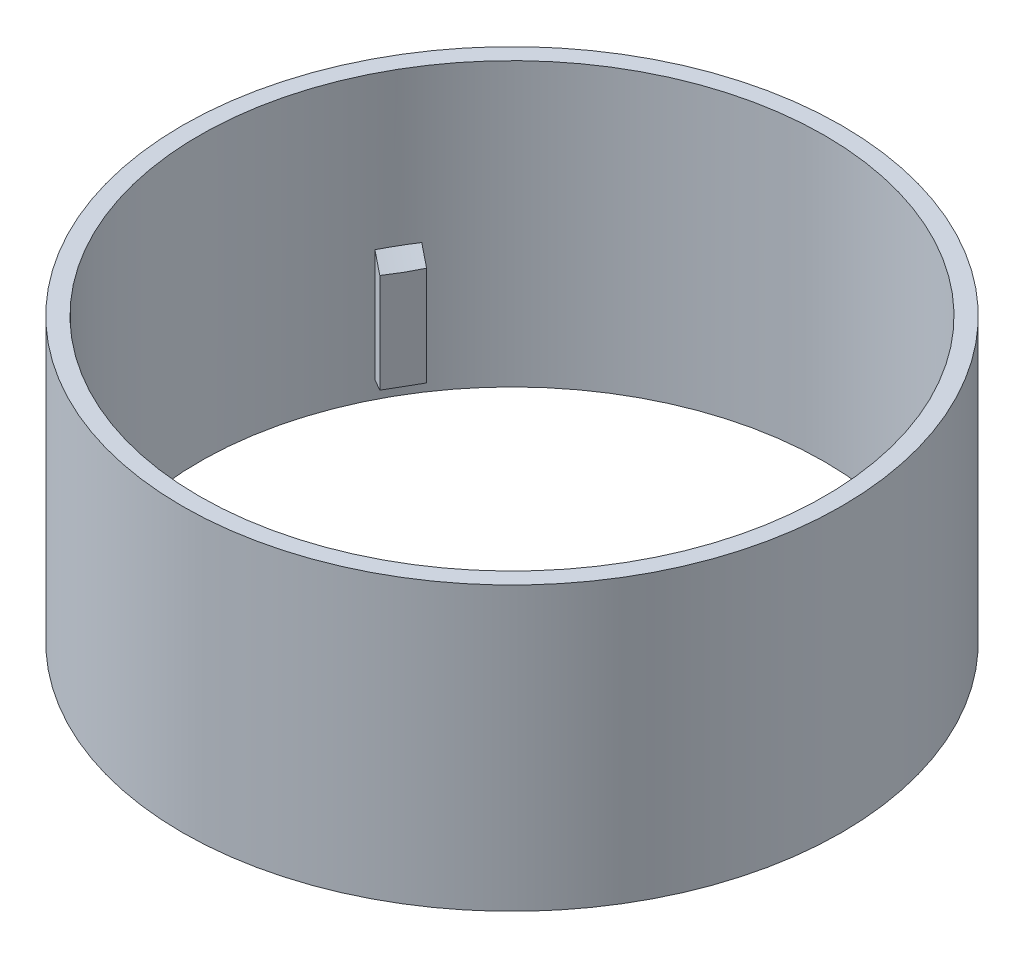
ISO-10303-21;
HEADER;
FILE_DESCRIPTION(('STEP AP214'),'2;1');
FILE_NAME('part.step','',(''),(''),'','','');
FILE_SCHEMA(('AUTOMOTIVE_DESIGN { 1 0 10303 214 1 1 1 1 }'));
ENDSEC;
DATA;
#1=APPLICATION_CONTEXT('core data for automotive mechanical design processes');
#2=APPLICATION_PROTOCOL_DEFINITION('international standard','automotive_design',2000,#1);
#3=PRODUCT_CONTEXT('',#1,'mechanical');
#4=PRODUCT('Part','Part','',(#3));
#5=PRODUCT_RELATED_PRODUCT_CATEGORY('part','',(#4));
#6=PRODUCT_DEFINITION_FORMATION('','',#4);
#7=PRODUCT_DEFINITION_CONTEXT('part definition',#1,'design');
#8=PRODUCT_DEFINITION('design','',#6,#7);
#9=PRODUCT_DEFINITION_SHAPE('','',#8);
#10=(LENGTH_UNIT() NAMED_UNIT(*) SI_UNIT(.MILLI.,.METRE.));
#11=(NAMED_UNIT(*) PLANE_ANGLE_UNIT() SI_UNIT($,.RADIAN.));
#12=(NAMED_UNIT(*) SI_UNIT($,.STERADIAN.) SOLID_ANGLE_UNIT());
#13=UNCERTAINTY_MEASURE_WITH_UNIT(LENGTH_MEASURE(1.E-05),#10,'distance_accuracy_value','');
#14=(GEOMETRIC_REPRESENTATION_CONTEXT(3) GLOBAL_UNCERTAINTY_ASSIGNED_CONTEXT((#13)) GLOBAL_UNIT_ASSIGNED_CONTEXT((#10,
#11,#12)) REPRESENTATION_CONTEXT('',''));
#15=CARTESIAN_POINT('',(0.,0.,0.));
#16=DIRECTION('',(0.,0.,1.));
#17=DIRECTION('',(1.,0.,0.));
#18=AXIS2_PLACEMENT_3D('',#15,#16,#17);
#19=CARTESIAN_POINT('',(0.,40.,0.));
#20=DIRECTION('',(0.,-1.,0.));
#21=DIRECTION('',(0.,0.,-1.));
#22=AXIS2_PLACEMENT_3D('',#19,#20,#21);
#23=CYLINDRICAL_SURFACE('',#22,38.5);
#24=CARTESIAN_POINT('',(0.,40.,0.));
#25=DIRECTION('',(0.,1.,0.));
#26=DIRECTION('',(0.,0.,1.));
#27=AXIS2_PLACEMENT_3D('',#24,#25,#26);
#28=CIRCLE('',#27,38.5);
#29=CARTESIAN_POINT('',(0.,40.,38.5));
#30=VERTEX_POINT('',#29);
#31=EDGE_CURVE('E190',#30,#30,#28,.T.);
#32=ORIENTED_EDGE('',*,*,#31,.F.);
#33=EDGE_LOOP('',(#32));
#34=FACE_BOUND('',#33,.T.);
#35=CARTESIAN_POINT('',(0.,7.,0.));
#36=DIRECTION('',(0.,-1.,0.));
#37=DIRECTION('',(0.,0.,-1.));
#38=AXIS2_PLACEMENT_3D('',#35,#36,#37);
#39=CIRCLE('',#38,38.5);
#40=CARTESIAN_POINT('',(0.,7.,-38.5));
#41=VERTEX_POINT('',#40);
#42=EDGE_CURVE('E154',#41,#41,#39,.T.);
#43=ORIENTED_EDGE('',*,*,#42,.F.);
#44=EDGE_LOOP('',(#43));
#45=FACE_BOUND('',#44,.T.);
#46=ADVANCED_FACE('F35',(#34,#45),#23,.T.);
#47=CARTESIAN_POINT('',(0.,40.,0.));
#48=DIRECTION('',(0.,-1.,0.));
#49=DIRECTION('',(0.,0.,-1.));
#50=AXIS2_PLACEMENT_3D('',#47,#48,#49);
#51=CYLINDRICAL_SURFACE('',#50,36.5);
#52=CARTESIAN_POINT('',(0.,40.,0.));
#53=DIRECTION('',(0.,1.,0.));
#54=DIRECTION('',(0.,0.,1.));
#55=AXIS2_PLACEMENT_3D('',#52,#53,#54);
#56=CIRCLE('',#55,36.5);
#57=CARTESIAN_POINT('',(0.,40.,36.5));
#58=VERTEX_POINT('',#57);
#59=EDGE_CURVE('E185',#58,#58,#56,.T.);
#60=ORIENTED_EDGE('',*,*,#59,.T.);
#61=EDGE_LOOP('',(#60));
#62=FACE_BOUND('',#61,.T.);
#63=DIRECTION('',(0.,-1.,0.));
#64=VECTOR('',#63,1.);
#65=CARTESIAN_POINT('',(1.95,40.,36.4478737377093));
#66=LINE('',#65,#64);
#67=CARTESIAN_POINT('',(1.95,22.1470722684002,36.4478737377093));
#68=VERTEX_POINT('',#67);
#69=CARTESIAN_POINT('',(1.95,9.,36.4478737377093));
#70=VERTEX_POINT('',#69);
#71=EDGE_CURVE('E198',#68,#70,#66,.T.);
#72=ORIENTED_EDGE('',*,*,#71,.F.);
#73=CARTESIAN_POINT('',(0.,22.1470722684002,0.));
#74=DIRECTION('',(0.,1.,0.));
#75=DIRECTION('',(0.,0.,1.));
#76=AXIS2_PLACEMENT_3D('',#73,#74,#75);
#77=CIRCLE('',#76,36.5);
#78=CARTESIAN_POINT('',(-2.05,22.1470722684002,36.4423860360432));
#79=VERTEX_POINT('',#78);
#80=EDGE_CURVE('E223',#68,#79,#77,.F.);
#81=ORIENTED_EDGE('',*,*,#80,.T.);
#82=DIRECTION('',(0.,-1.,0.));
#83=VECTOR('',#82,1.);
#84=CARTESIAN_POINT('',(-2.05,40.,36.4423860360432));
#85=LINE('',#84,#83);
#86=CARTESIAN_POINT('',(-2.05,9.,36.4423860360432));
#87=VERTEX_POINT('',#86);
#88=EDGE_CURVE('E196',#87,#79,#85,.F.);
#89=ORIENTED_EDGE('',*,*,#88,.F.);
#90=CARTESIAN_POINT('',(0.,9.,0.));
#91=DIRECTION('',(0.,-1.,0.));
#92=DIRECTION('',(0.,0.,-1.));
#93=AXIS2_PLACEMENT_3D('',#90,#91,#92);
#94=CIRCLE('',#93,36.5);
#95=EDGE_CURVE('E193',#70,#87,#94,.T.);
#96=ORIENTED_EDGE('',*,*,#95,.F.);
#97=EDGE_LOOP('',(#72,#81,#89,#96));
#98=FACE_BOUND('',#97,.T.);
#99=DIRECTION('',(0.,-1.,0.));
#100=VECTOR('',#99,1.);
#101=CARTESIAN_POINT('',(-32.5397845707839,40.,-16.5351873314752));
#102=LINE('',#101,#100);
#103=CARTESIAN_POINT('',(-32.5397845707839,22.1470722684002,-16.5351873314752));
#104=VERTEX_POINT('',#103);
#105=CARTESIAN_POINT('',(-32.5397845707839,9.,-16.5351873314752));
#106=VERTEX_POINT('',#105);
#107=EDGE_CURVE('E206',#104,#106,#102,.T.);
#108=ORIENTED_EDGE('',*,*,#107,.F.);
#109=CARTESIAN_POINT('',(0.,22.1470722684002,0.));
#110=DIRECTION('',(0.,1.,0.));
#111=DIRECTION('',(0.,0.,1.));
#112=AXIS2_PLACEMENT_3D('',#109,#110,#111);
#113=CIRCLE('',#112,36.5);
#114=CARTESIAN_POINT('',(-30.5350320817326,22.1470722684002,-19.9965450957799));
#115=VERTEX_POINT('',#114);
#116=EDGE_CURVE('E220',#104,#115,#113,.F.);
#117=ORIENTED_EDGE('',*,*,#116,.T.);
#118=DIRECTION('',(0.,-1.,0.));
#119=VECTOR('',#118,1.);
#120=CARTESIAN_POINT('',(-30.5350320817326,40.,-19.9965450957799));
#121=LINE('',#120,#119);
#122=CARTESIAN_POINT('',(-30.5350320817326,9.,-19.9965450957799));
#123=VERTEX_POINT('',#122);
#124=EDGE_CURVE('E204',#123,#115,#121,.F.);
#125=ORIENTED_EDGE('',*,*,#124,.F.);
#126=CARTESIAN_POINT('',(0.,9.,0.));
#127=DIRECTION('',(0.,-1.,0.));
#128=DIRECTION('',(0.,0.,-1.));
#129=AXIS2_PLACEMENT_3D('',#126,#127,#128);
#130=CIRCLE('',#129,36.5);
#131=EDGE_CURVE('E201',#106,#123,#130,.T.);
#132=ORIENTED_EDGE('',*,*,#131,.F.);
#133=EDGE_LOOP('',(#108,#117,#125,#132));
#134=FACE_BOUND('',#133,.T.);
#135=DIRECTION('',(0.,-1.,0.));
#136=VECTOR('',#135,1.);
#137=CARTESIAN_POINT('',(30.5897845707841,40.,-19.912686406234));
#138=LINE('',#137,#136);
#139=CARTESIAN_POINT('',(30.5897845707841,22.1470722684002,-19.912686406234));
#140=VERTEX_POINT('',#139);
#141=CARTESIAN_POINT('',(30.5897845707841,9.,-19.912686406234));
#142=VERTEX_POINT('',#141);
#143=EDGE_CURVE('E212',#140,#142,#138,.T.);
#144=ORIENTED_EDGE('',*,*,#143,.F.);
#145=CARTESIAN_POINT('',(0.,22.1470722684002,0.));
#146=DIRECTION('',(0.,1.,0.));
#147=DIRECTION('',(0.,0.,1.));
#148=AXIS2_PLACEMENT_3D('',#145,#146,#147);
#149=CIRCLE('',#148,36.5);
#150=CARTESIAN_POINT('',(32.5850320817329,22.1470722684002,-16.4458409402632));
#151=VERTEX_POINT('',#150);
#152=EDGE_CURVE('E215',#140,#151,#149,.F.);
#153=ORIENTED_EDGE('',*,*,#152,.T.);
#154=DIRECTION('',(0.,-1.,0.));
#155=VECTOR('',#154,1.);
#156=CARTESIAN_POINT('',(32.5850320817329,40.,-16.4458409402632));
#157=LINE('',#156,#155);
#158=CARTESIAN_POINT('',(32.5850320817329,9.,-16.4458409402632));
#159=VERTEX_POINT('',#158);
#160=EDGE_CURVE('E210',#159,#151,#157,.F.);
#161=ORIENTED_EDGE('',*,*,#160,.F.);
#162=CARTESIAN_POINT('',(0.,9.,0.));
#163=DIRECTION('',(0.,-1.,0.));
#164=DIRECTION('',(0.,0.,-1.));
#165=AXIS2_PLACEMENT_3D('',#162,#163,#164);
#166=CIRCLE('',#165,36.5);
#167=EDGE_CURVE('E145',#142,#159,#166,.T.);
#168=ORIENTED_EDGE('',*,*,#167,.F.);
#169=EDGE_LOOP('',(#144,#153,#161,#168));
#170=FACE_BOUND('',#169,.T.);
#171=CARTESIAN_POINT('',(0.,7.,0.));
#172=DIRECTION('',(0.,-1.,0.));
#173=DIRECTION('',(0.,0.,-1.));
#174=AXIS2_PLACEMENT_3D('',#171,#172,#173);
#175=CIRCLE('',#174,36.5);
#176=CARTESIAN_POINT('',(0.,7.,-36.5));
#177=VERTEX_POINT('',#176);
#178=EDGE_CURVE('E157',#177,#177,#175,.T.);
#179=ORIENTED_EDGE('',*,*,#178,.T.);
#180=EDGE_LOOP('',(#179));
#181=FACE_BOUND('',#180,.T.);
#182=ADVANCED_FACE('F264',(#62,#98,#134,#170,#181),#51,.F.);
#183=CARTESIAN_POINT('',(0.,40.,0.));
#184=DIRECTION('',(0.,1.,0.));
#185=DIRECTION('',(0.,0.,1.));
#186=AXIS2_PLACEMENT_3D('',#183,#184,#185);
#187=PLANE('',#186);
#188=ORIENTED_EDGE('',*,*,#31,.T.);
#189=EDGE_LOOP('',(#188));
#190=FACE_BOUND('',#189,.T.);
#191=ORIENTED_EDGE('',*,*,#59,.F.);
#192=EDGE_LOOP('',(#191));
#193=FACE_BOUND('',#192,.T.);
#194=ADVANCED_FACE('F258',(#190,#193),#187,.T.);
#195=CARTESIAN_POINT('',(1.95,9.,34.9));
#196=DIRECTION('',(0.,-1.,0.));
#197=DIRECTION('',(0.,0.,-1.));
#198=AXIS2_PLACEMENT_3D('',#195,#196,#197);
#199=PLANE('',#198);
#200=DIRECTION('',(0.,0.,1.));
#201=VECTOR('',#200,1.);
#202=CARTESIAN_POINT('',(1.95,9.,34.9));
#203=LINE('',#202,#201);
#204=CARTESIAN_POINT('',(1.95,9.,34.9));
#205=VERTEX_POINT('',#204);
#206=EDGE_CURVE('E182',#205,#70,#203,.T.);
#207=ORIENTED_EDGE('',*,*,#206,.T.);
#208=ORIENTED_EDGE('',*,*,#95,.T.);
#209=DIRECTION('',(0.,0.,1.));
#210=VECTOR('',#209,1.);
#211=CARTESIAN_POINT('',(-2.05,9.,34.9));
#212=LINE('',#211,#210);
#213=CARTESIAN_POINT('',(-2.05,9.,34.9));
#214=VERTEX_POINT('',#213);
#215=EDGE_CURVE('E181',#214,#87,#212,.T.);
#216=ORIENTED_EDGE('',*,*,#215,.F.);
#217=DIRECTION('',(1.,0.,0.));
#218=VECTOR('',#217,1.);
#219=CARTESIAN_POINT('',(1.95,9.,34.9));
#220=LINE('',#219,#218);
#221=EDGE_CURVE('E177',#214,#205,#220,.T.);
#222=ORIENTED_EDGE('',*,*,#221,.T.);
#223=EDGE_LOOP('',(#207,#208,#216,#222));
#224=FACE_BOUND('',#223,.T.);
#225=ADVANCED_FACE('F255',(#224),#199,.T.);
#226=CARTESIAN_POINT('',(-2.05,20.4470722684002,34.9));
#227=DIRECTION('',(-1.,0.,0.));
#228=DIRECTION('',(0.,-1.,0.));
#229=AXIS2_PLACEMENT_3D('',#226,#227,#228);
#230=PLANE('',#229);
#231=ORIENTED_EDGE('',*,*,#215,.T.);
#232=ORIENTED_EDGE('',*,*,#88,.T.);
#233=CARTESIAN_POINT('',(-2.05,22.1470722684002,36.4423860360432));
#234=CARTESIAN_POINT('',(-2.05,21.8904224321134,36.1853308332608));
#235=CARTESIAN_POINT('',(-2.05,21.6337771716459,35.9282710622002));
#236=CARTESIAN_POINT('',(-2.05,21.1204958023463,35.4141423835191));
#237=CARTESIAN_POINT('',(-2.05,20.863859693514,35.1570734758987));
#238=CARTESIAN_POINT('',(-2.05,20.6072281605011,34.9));
#239=B_SPLINE_CURVE_WITH_KNOTS('',3,(#233,#234,#235,#236,#237,#238),.UNSPECIFIED.,.F.,.F.,(4,2,
4),(0.,1.08973328872857,2.17946657747203),.UNSPECIFIED.);
#240=CARTESIAN_POINT('',(-2.05,20.6072281605011,34.9));
#241=VERTEX_POINT('',#240);
#242=EDGE_CURVE('E266',#79,#241,#239,.T.);
#243=ORIENTED_EDGE('',*,*,#242,.T.);
#244=DIRECTION('',(0.,-1.,0.));
#245=VECTOR('',#244,1.);
#246=CARTESIAN_POINT('',(-2.05,20.4470722684002,34.9));
#247=LINE('',#246,#245);
#248=EDGE_CURVE('E76',#241,#214,#247,.T.);
#249=ORIENTED_EDGE('',*,*,#248,.T.);
#250=EDGE_LOOP('',(#231,#232,#243,#249));
#251=FACE_BOUND('',#250,.T.);
#252=ADVANCED_FACE('F254',(#251),#230,.T.);
#253=CARTESIAN_POINT('',(1.95,20.4470722684002,34.9));
#254=DIRECTION('',(1.,0.,0.));
#255=DIRECTION('',(0.,1.,0.));
#256=AXIS2_PLACEMENT_3D('',#253,#254,#255);
#257=PLANE('',#256);
#258=DIRECTION('',(0.,1.,0.));
#259=VECTOR('',#258,1.);
#260=CARTESIAN_POINT('',(1.95,20.4470722684002,34.9));
#261=LINE('',#260,#259);
#262=CARTESIAN_POINT('',(1.95,20.6015068940668,34.9));
#263=VERTEX_POINT('',#262);
#264=EDGE_CURVE('E85',#205,#263,#261,.T.);
#265=ORIENTED_EDGE('',*,*,#264,.T.);
#266=CARTESIAN_POINT('',(1.95,20.6015068940668,34.9));
#267=CARTESIAN_POINT('',(1.95,20.8590927827987,35.1579872841735));
#268=CARTESIAN_POINT('',(1.95,21.1166828416931,35.4159704044034));
#269=CARTESIAN_POINT('',(1.95,21.6318712998042,35.9319283169732));
#270=CARTESIAN_POINT('',(1.95,21.8894696990209,36.189903109313));
#271=CARTESIAN_POINT('',(1.95,22.1470722684002,36.4478737377093));
#272=B_SPLINE_CURVE_WITH_KNOTS('',3,(#266,#267,#268,#269,#270,#271),.UNSPECIFIED.,.F.,.F.,(4,2,
4),(0.,1.09369619130872,2.18739238260507),.UNSPECIFIED.);
#273=EDGE_CURVE('E233',#263,#68,#272,.T.);
#274=ORIENTED_EDGE('',*,*,#273,.T.);
#275=ORIENTED_EDGE('',*,*,#71,.T.);
#276=ORIENTED_EDGE('',*,*,#206,.F.);
#277=EDGE_LOOP('',(#265,#274,#275,#276));
#278=FACE_BOUND('',#277,.T.);
#279=ADVANCED_FACE('F247',(#278),#257,.T.);
#280=CARTESIAN_POINT('',(0.,0.,34.9));
#281=DIRECTION('',(0.,0.,-1.));
#282=DIRECTION('',(-1.,0.,0.));
#283=AXIS2_PLACEMENT_3D('',#280,#281,#282);
#284=PLANE('',#283);
#285=ORIENTED_EDGE('',*,*,#248,.F.);
#286=CARTESIAN_POINT('',(-2.05,20.6072281605011,34.9));
#287=CARTESIAN_POINT('',(-1.38331294182691,20.5680973376424,34.9));
#288=CARTESIAN_POINT('',(-0.71659863925139,20.5480572443269,34.9));
#289=CARTESIAN_POINT('',(0.616734706318611,20.546158730007,34.9));
#290=CARTESIAN_POINT('',(1.28335373707643,20.5642917345111,34.9));
#291=CARTESIAN_POINT('',(1.95,20.6015068940668,34.9));
#292=B_SPLINE_CURVE_WITH_KNOTS('',3,(#286,#287,#288,#289,#290,#291),.UNSPECIFIED.,.F.,.F.,(4,2,
4),(0.,2.00104625118703,4.00164307268493),.UNSPECIFIED.);
#293=EDGE_CURVE('E226',#241,#263,#292,.T.);
#294=ORIENTED_EDGE('',*,*,#293,.T.);
#295=ORIENTED_EDGE('',*,*,#264,.F.);
#296=ORIENTED_EDGE('',*,*,#221,.F.);
#297=EDGE_LOOP('',(#285,#294,#295,#296));
#298=FACE_BOUND('',#297,.T.);
#299=ADVANCED_FACE('F242',(#298),#284,.T.);
#300=CARTESIAN_POINT('',(-31.1992865920768,9.,-15.7612504626205));
#301=DIRECTION('',(0.,-1.,0.));
#302=DIRECTION('',(0.,0.,-1.));
#303=AXIS2_PLACEMENT_3D('',#300,#301,#302);
#304=PLANE('',#303);
#305=DIRECTION('',(-0.866025403784436,0.,-0.500000000000004));
#306=VECTOR('',#305,1.);
#307=CARTESIAN_POINT('',(-31.1992865920768,9.,-15.7612504626205));
#308=LINE('',#307,#306);
#309=CARTESIAN_POINT('',(-31.1992865920768,9.,-15.7612504626205));
#310=VERTEX_POINT('',#309);
#311=EDGE_CURVE('E171',#310,#106,#308,.T.);
#312=ORIENTED_EDGE('',*,*,#311,.T.);
#313=ORIENTED_EDGE('',*,*,#131,.T.);
#314=DIRECTION('',(-0.866025403784436,0.,-0.500000000000004));
#315=VECTOR('',#314,1.);
#316=CARTESIAN_POINT('',(-29.1992865920768,9.,-19.2253520777582));
#317=LINE('',#316,#315);
#318=CARTESIAN_POINT('',(-29.1992865920768,9.,-19.2253520777582));
#319=VERTEX_POINT('',#318);
#320=EDGE_CURVE('E170',#319,#123,#317,.T.);
#321=ORIENTED_EDGE('',*,*,#320,.F.);
#322=DIRECTION('',(-0.500000000000004,0.,0.866025403784436));
#323=VECTOR('',#322,1.);
#324=CARTESIAN_POINT('',(-31.1992865920768,9.,-15.7612504626205));
#325=LINE('',#324,#323);
#326=EDGE_CURVE('E165',#319,#310,#325,.T.);
#327=ORIENTED_EDGE('',*,*,#326,.T.);
#328=EDGE_LOOP('',(#312,#313,#321,#327));
#329=FACE_BOUND('',#328,.T.);
#330=ADVANCED_FACE('F246',(#329),#304,.T.);
#331=CARTESIAN_POINT('',(-29.1992865920768,20.4470722684002,-19.2253520777582));
#332=DIRECTION('',(0.500000000000004,0.,-0.866025403784436));
#333=DIRECTION('',(-0.866025403784436,0.,-0.500000000000004));
#334=AXIS2_PLACEMENT_3D('',#331,#332,#333);
#335=PLANE('',#334);
#336=ORIENTED_EDGE('',*,*,#320,.T.);
#337=ORIENTED_EDGE('',*,*,#124,.T.);
#338=CARTESIAN_POINT('',(-30.5350320817326,22.1470722684002,-19.9965450957799));
#339=CARTESIAN_POINT('',(-30.3124157459481,21.8904224321134,-19.8680174943886));
#340=CARTESIAN_POINT('',(-30.0897954539186,21.6337771716459,-19.7394876088583));
#341=CARTESIAN_POINT('',(-29.6445469573667,21.1204958023463,-19.4824232695178));
#342=CARTESIAN_POINT('',(-29.4219187528442,20.863859693514,-19.3538888157076));
#343=CARTESIAN_POINT('',(-29.1992865920768,20.6072281605011,-19.2253520777582));
#344=B_SPLINE_CURVE_WITH_KNOTS('',3,(#338,#339,#340,#341,#342,#343),.UNSPECIFIED.,.F.,.F.,(4,2,
4),(0.,1.08973328872857,2.17946657747203),.UNSPECIFIED.);
#345=CARTESIAN_POINT('',(-29.1992865920768,20.6072281605011,-19.2253520777582));
#346=VERTEX_POINT('',#345);
#347=EDGE_CURVE('E343',#115,#346,#344,.T.);
#348=ORIENTED_EDGE('',*,*,#347,.T.);
#349=DIRECTION('',(0.,-1.,0.));
#350=VECTOR('',#349,1.);
#351=CARTESIAN_POINT('',(-29.1992865920768,20.4470722684002,-19.2253520777582));
#352=LINE('',#351,#350);
#353=EDGE_CURVE('E161',#346,#319,#352,.T.);
#354=ORIENTED_EDGE('',*,*,#353,.T.);
#355=EDGE_LOOP('',(#336,#337,#348,#354));
#356=FACE_BOUND('',#355,.T.);
#357=ADVANCED_FACE('F248',(#356),#335,.T.);
#358=CARTESIAN_POINT('',(-31.1992865920768,20.4470722684002,-15.7612504626205));
#359=DIRECTION('',(-0.500000000000004,0.,0.866025403784436));
#360=DIRECTION('',(0.866025403784436,0.,0.500000000000004));
#361=AXIS2_PLACEMENT_3D('',#358,#359,#360);
#362=PLANE('',#361);
#363=DIRECTION('',(0.,1.,0.));
#364=VECTOR('',#363,1.);
#365=CARTESIAN_POINT('',(-31.1992865920768,20.4470722684002,-15.7612504626205));
#366=LINE('',#365,#364);
#367=CARTESIAN_POINT('',(-31.1992865920768,20.6015068940668,-15.7612504626205));
#368=VERTEX_POINT('',#367);
#369=EDGE_CURVE('E168',#310,#368,#366,.T.);
#370=ORIENTED_EDGE('',*,*,#369,.T.);
#371=CARTESIAN_POINT('',(-31.1992865920768,20.6015068940668,-15.7612504626205));
#372=CARTESIAN_POINT('',(-31.4227101340244,20.8590927827987,-15.8902441047072));
#373=CARTESIAN_POINT('',(-31.6461300698911,21.1166828416931,-16.0192356648222));
#374=CARTESIAN_POINT('',(-32.0929627294601,21.6318712998042,-16.2772146211071));
#375=CARTESIAN_POINT('',(-32.3163754531624,21.8894696990209,-16.406202017277));
#376=CARTESIAN_POINT('',(-32.5397845707839,22.1470722684002,-16.5351873314752));
#377=B_SPLINE_CURVE_WITH_KNOTS('',3,(#371,#372,#373,#374,#375,#376),.UNSPECIFIED.,.F.,.F.,(4,2,
4),(0.,1.09369619130872,2.18739238260507),.UNSPECIFIED.);
#378=EDGE_CURVE('E278',#368,#104,#377,.T.);
#379=ORIENTED_EDGE('',*,*,#378,.T.);
#380=ORIENTED_EDGE('',*,*,#107,.T.);
#381=ORIENTED_EDGE('',*,*,#311,.F.);
#382=EDGE_LOOP('',(#370,#379,#380,#381));
#383=FACE_BOUND('',#382,.T.);
#384=ADVANCED_FACE('F289',(#383),#362,.T.);
#385=CARTESIAN_POINT('',(-30.2242865920768,0.,-17.4500000000001));
#386=DIRECTION('',(0.866025403784436,0.,0.500000000000004));
#387=DIRECTION('',(0.500000000000004,0.,-0.866025403784436));
#388=AXIS2_PLACEMENT_3D('',#385,#386,#387);
#389=PLANE('',#388);
#390=ORIENTED_EDGE('',*,*,#353,.F.);
#391=CARTESIAN_POINT('',(-29.1992865920768,20.6072281605011,-19.2253520777582));
#392=CARTESIAN_POINT('',(-29.5326301211634,20.5680973376424,-18.647984149006));
#393=CARTESIAN_POINT('',(-29.8659872724511,20.5480572443269,-18.0705926259092));
#394=CARTESIAN_POINT('',(-30.5326539452361,20.546158730007,-16.9158920769327));
#395=CARTESIAN_POINT('',(-30.865963460615,20.5642917345111,-16.3385830616503));
#396=CARTESIAN_POINT('',(-31.1992865920768,20.6015068940668,-15.7612504626205));
#397=B_SPLINE_CURVE_WITH_KNOTS('',3,(#391,#392,#393,#394,#395,#396),.UNSPECIFIED.,.F.,.F.,(4,2,
4),(0.,2.00104625118703,4.00164307268493),.UNSPECIFIED.);
#398=EDGE_CURVE('E271',#346,#368,#397,.T.);
#399=ORIENTED_EDGE('',*,*,#398,.T.);
#400=ORIENTED_EDGE('',*,*,#369,.F.);
#401=ORIENTED_EDGE('',*,*,#326,.F.);
#402=EDGE_LOOP('',(#390,#399,#400,#401));
#403=FACE_BOUND('',#402,.T.);
#404=ADVANCED_FACE('F286',(#403),#389,.T.);
#405=CARTESIAN_POINT('',(29.2492865920771,9.,-19.1387495373794));
#406=DIRECTION('',(0.,-1.,0.));
#407=DIRECTION('',(0.,0.,-1.));
#408=AXIS2_PLACEMENT_3D('',#405,#406,#407);
#409=PLANE('',#408);
#410=DIRECTION('',(0.866025403784443,0.,-0.499999999999992));
#411=VECTOR('',#410,1.);
#412=CARTESIAN_POINT('',(29.2492865920771,9.,-19.1387495373794));
#413=LINE('',#412,#411);
#414=CARTESIAN_POINT('',(29.2492865920771,9.,-19.1387495373794));
#415=VERTEX_POINT('',#414);
#416=EDGE_CURVE('E147',#415,#142,#413,.T.);
#417=ORIENTED_EDGE('',*,*,#416,.T.);
#418=ORIENTED_EDGE('',*,*,#167,.T.);
#419=DIRECTION('',(0.866025403784443,0.,-0.499999999999992));
#420=VECTOR('',#419,1.);
#421=CARTESIAN_POINT('',(31.2492865920771,9.,-15.6746479222416));
#422=LINE('',#421,#420);
#423=CARTESIAN_POINT('',(31.2492865920771,9.,-15.6746479222416));
#424=VERTEX_POINT('',#423);
#425=EDGE_CURVE('E141',#424,#159,#422,.T.);
#426=ORIENTED_EDGE('',*,*,#425,.F.);
#427=DIRECTION('',(-0.499999999999992,0.,-0.866025403784443));
#428=VECTOR('',#427,1.);
#429=CARTESIAN_POINT('',(29.2492865920771,9.,-19.1387495373794));
#430=LINE('',#429,#428);
#431=EDGE_CURVE('E144',#424,#415,#430,.T.);
#432=ORIENTED_EDGE('',*,*,#431,.T.);
#433=EDGE_LOOP('',(#417,#418,#426,#432));
#434=FACE_BOUND('',#433,.T.);
#435=ADVANCED_FACE('F143',(#434),#409,.T.);
#436=CARTESIAN_POINT('',(31.2492865920771,20.4470722684002,-15.6746479222416));
#437=DIRECTION('',(0.499999999999992,0.,0.866025403784443));
#438=DIRECTION('',(0.866025403784443,0.,-0.499999999999992));
#439=AXIS2_PLACEMENT_3D('',#436,#437,#438);
#440=PLANE('',#439);
#441=ORIENTED_EDGE('',*,*,#425,.T.);
#442=ORIENTED_EDGE('',*,*,#160,.T.);
#443=CARTESIAN_POINT('',(32.5850320817329,22.1470722684002,-16.4458409402632));
#444=CARTESIAN_POINT('',(32.3624157459483,21.8904224321134,-16.317313338872));
#445=CARTESIAN_POINT('',(32.1397954539188,21.6337771716459,-16.1887834533417));
#446=CARTESIAN_POINT('',(31.6945469573669,21.1204958023463,-15.9317191140012));
#447=CARTESIAN_POINT('',(31.4719187528444,20.863859693514,-15.8031846601909));
#448=CARTESIAN_POINT('',(31.2492865920771,20.6072281605011,-15.6746479222416));
#449=B_SPLINE_CURVE_WITH_KNOTS('',3,(#443,#444,#445,#446,#447,#448),.UNSPECIFIED.,.F.,.F.,(4,2,
4),(0.,1.08973328872858,2.17946657747204),.UNSPECIFIED.);
#450=CARTESIAN_POINT('',(31.2492865920771,20.6072281605011,-15.6746479222416));
#451=VERTEX_POINT('',#450);
#452=EDGE_CURVE('E11',#151,#451,#449,.T.);
#453=ORIENTED_EDGE('',*,*,#452,.T.);
#454=DIRECTION('',(0.,-1.,0.));
#455=VECTOR('',#454,1.);
#456=CARTESIAN_POINT('',(31.2492865920771,20.4470722684002,-15.6746479222416));
#457=LINE('',#456,#455);
#458=EDGE_CURVE('E55',#451,#424,#457,.T.);
#459=ORIENTED_EDGE('',*,*,#458,.T.);
#460=EDGE_LOOP('',(#441,#442,#453,#459));
#461=FACE_BOUND('',#460,.T.);
#462=ADVANCED_FACE('F151',(#461),#440,.T.);
#463=CARTESIAN_POINT('',(29.2492865920771,20.4470722684002,-19.1387495373794));
#464=DIRECTION('',(-0.499999999999992,0.,-0.866025403784443));
#465=DIRECTION('',(-0.866025403784443,0.,0.499999999999992));
#466=AXIS2_PLACEMENT_3D('',#463,#464,#465);
#467=PLANE('',#466);
#468=DIRECTION('',(0.,1.,0.));
#469=VECTOR('',#468,1.);
#470=CARTESIAN_POINT('',(29.2492865920771,20.4470722684002,-19.1387495373794));
#471=LINE('',#470,#469);
#472=CARTESIAN_POINT('',(29.2492865920771,20.6015068940668,-19.1387495373794));
#473=VERTEX_POINT('',#472);
#474=EDGE_CURVE('E63',#415,#473,#471,.T.);
#475=ORIENTED_EDGE('',*,*,#474,.T.);
#476=CARTESIAN_POINT('',(29.2492865920771,20.6015068940668,-19.1387495373794));
#477=CARTESIAN_POINT('',(29.4727101340247,20.8590927827986,-19.2677431794661));
#478=CARTESIAN_POINT('',(29.6961300698914,21.1166828416931,-19.3967347395811));
#479=CARTESIAN_POINT('',(30.1429627294604,21.6318712998042,-19.654713695866));
#480=CARTESIAN_POINT('',(30.3663754531627,21.8894696990209,-19.7837010920359));
#481=CARTESIAN_POINT('',(30.5897845707841,22.1470722684002,-19.912686406234));
#482=B_SPLINE_CURVE_WITH_KNOTS('',3,(#476,#477,#478,#479,#480,#481),.UNSPECIFIED.,.F.,.F.,(4,2,
4),(0.,1.09369619130872,2.18739238260508),.UNSPECIFIED.);
#483=EDGE_CURVE('E48',#473,#140,#482,.T.);
#484=ORIENTED_EDGE('',*,*,#483,.T.);
#485=ORIENTED_EDGE('',*,*,#143,.T.);
#486=ORIENTED_EDGE('',*,*,#416,.F.);
#487=EDGE_LOOP('',(#475,#484,#485,#486));
#488=FACE_BOUND('',#487,.T.);
#489=ADVANCED_FACE('F333',(#488),#467,.T.);
#490=CARTESIAN_POINT('',(30.2242865920771,0.,-17.4499999999997));
#491=DIRECTION('',(-0.866025403784443,0.,0.499999999999992));
#492=DIRECTION('',(0.499999999999992,0.,0.866025403784443));
#493=AXIS2_PLACEMENT_3D('',#490,#491,#492);
#494=PLANE('',#493);
#495=ORIENTED_EDGE('',*,*,#458,.F.);
#496=CARTESIAN_POINT('',(31.2492865920771,20.6072281605011,-15.6746479222416));
#497=CARTESIAN_POINT('',(30.9159430629905,20.5680973376424,-16.2520158509938));
#498=CARTESIAN_POINT('',(30.5825859117028,20.5480572443269,-16.8294073740906));
#499=CARTESIAN_POINT('',(29.9159192389178,20.546158730007,-17.9841079230672));
#500=CARTESIAN_POINT('',(29.5826097235389,20.5642917345111,-18.5614169383496));
#501=CARTESIAN_POINT('',(29.2492865920771,20.6015068940668,-19.1387495373794));
#502=B_SPLINE_CURVE_WITH_KNOTS('',3,(#496,#497,#498,#499,#500,#501),.UNSPECIFIED.,.F.,.F.,(4,2,
4),(0.,2.00104625118703,4.00164307268493),.UNSPECIFIED.);
#503=EDGE_CURVE('E339',#451,#473,#502,.T.);
#504=ORIENTED_EDGE('',*,*,#503,.T.);
#505=ORIENTED_EDGE('',*,*,#474,.F.);
#506=ORIENTED_EDGE('',*,*,#431,.F.);
#507=EDGE_LOOP('',(#495,#504,#505,#506));
#508=FACE_BOUND('',#507,.T.);
#509=ADVANCED_FACE('F149',(#508),#494,.T.);
#510=CARTESIAN_POINT('',(0.,7.,0.));
#511=DIRECTION('',(0.,-1.,0.));
#512=DIRECTION('',(0.,0.,-1.));
#513=AXIS2_PLACEMENT_3D('',#510,#511,#512);
#514=PLANE('',#513);
#515=ORIENTED_EDGE('',*,*,#178,.F.);
#516=EDGE_LOOP('',(#515));
#517=FACE_BOUND('',#516,.T.);
#518=ORIENTED_EDGE('',*,*,#42,.T.);
#519=EDGE_LOOP('',(#518));
#520=FACE_BOUND('',#519,.T.);
#521=ADVANCED_FACE('F323',(#517,#520),#514,.T.);
#522=CARTESIAN_POINT('',(0.,20.4470722684002,0.));
#523=DIRECTION('',(0.,1.,0.));
#524=DIRECTION('',(0.,0.,1.));
#525=AXIS2_PLACEMENT_3D('',#522,#523,#524);
#526=CONICAL_SURFACE('',#525,34.8,0.785398163397453);
#527=ORIENTED_EDGE('',*,*,#242,.F.);
#528=ORIENTED_EDGE('',*,*,#80,.F.);
#529=ORIENTED_EDGE('',*,*,#273,.F.);
#530=ORIENTED_EDGE('',*,*,#293,.F.);
#531=EDGE_LOOP('',(#527,#528,#529,#530));
#532=FACE_BOUND('',#531,.T.);
#533=ADVANCED_FACE('F239',(#532),#526,.F.);
#534=CARTESIAN_POINT('',(0.,20.4470722684002,0.));
#535=DIRECTION('',(0.,1.,0.));
#536=DIRECTION('',(0.,0.,1.));
#537=AXIS2_PLACEMENT_3D('',#534,#535,#536);
#538=CONICAL_SURFACE('',#537,34.8,0.785398163397453);
#539=ORIENTED_EDGE('',*,*,#347,.F.);
#540=ORIENTED_EDGE('',*,*,#116,.F.);
#541=ORIENTED_EDGE('',*,*,#378,.F.);
#542=ORIENTED_EDGE('',*,*,#398,.F.);
#543=EDGE_LOOP('',(#539,#540,#541,#542));
#544=FACE_BOUND('',#543,.T.);
#545=ADVANCED_FACE('F284',(#544),#538,.F.);
#546=CARTESIAN_POINT('',(0.,20.4470722684002,0.));
#547=DIRECTION('',(0.,1.,0.));
#548=DIRECTION('',(0.,0.,1.));
#549=AXIS2_PLACEMENT_3D('',#546,#547,#548);
#550=CONICAL_SURFACE('',#549,34.8,0.785398163397453);
#551=ORIENTED_EDGE('',*,*,#452,.F.);
#552=ORIENTED_EDGE('',*,*,#152,.F.);
#553=ORIENTED_EDGE('',*,*,#483,.F.);
#554=ORIENTED_EDGE('',*,*,#503,.F.);
#555=EDGE_LOOP('',(#551,#552,#553,#554));
#556=FACE_BOUND('',#555,.T.);
#557=ADVANCED_FACE('F37',(#556),#550,.F.);
#558=CLOSED_SHELL('',(#46,#182,#194,#225,#252,#279,#299,#330,#357,#384,#404,#435,#462,#489,#509,
#521,#533,#545,#557));
#559=MANIFOLD_SOLID_BREP('B2',#558);
#560=ADVANCED_BREP_SHAPE_REPRESENTATION('',(#18,#559),#14);
#561=SHAPE_DEFINITION_REPRESENTATION(#9,#560);
ENDSEC;
END-ISO-10303-21;
